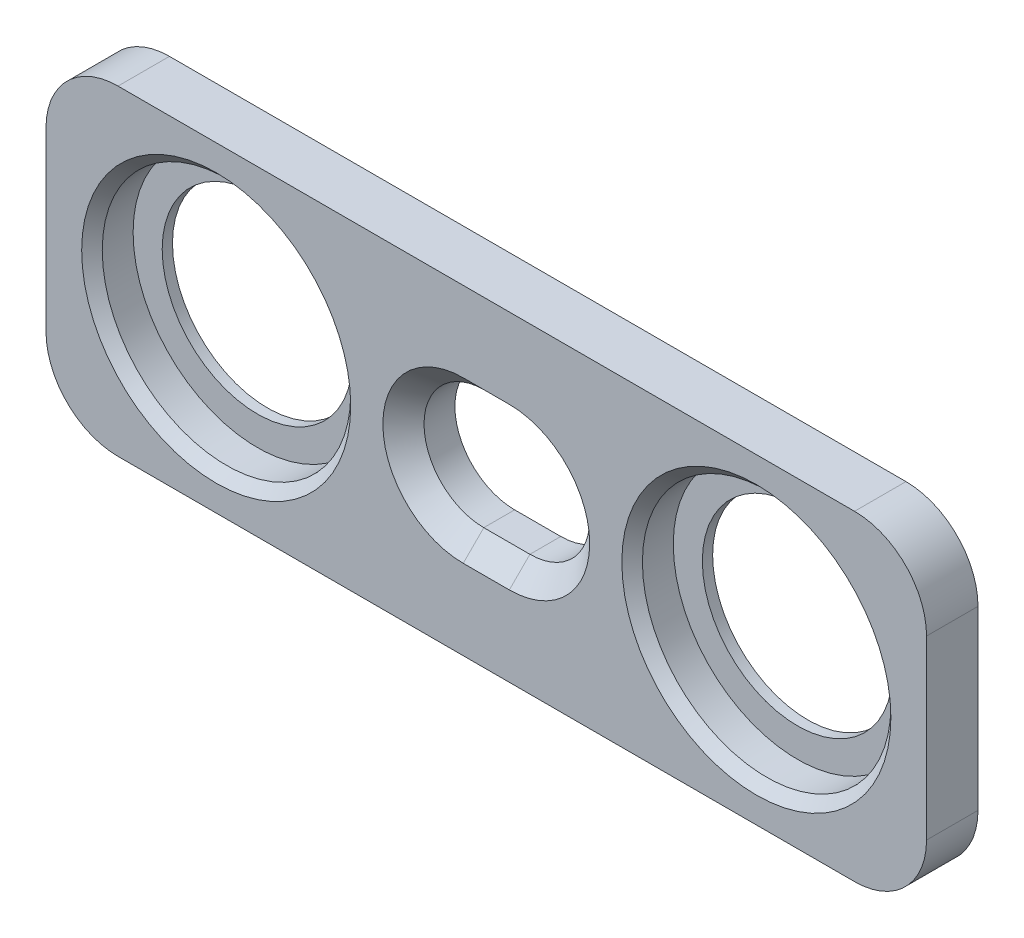
ISO-10303-21;
HEADER;
FILE_DESCRIPTION(('STEP AP214'),'2;1');
FILE_NAME('part.step','',(''),(''),'','','');
FILE_SCHEMA(('AUTOMOTIVE_DESIGN { 1 0 10303 214 1 1 1 1 }'));
ENDSEC;
DATA;
#1=APPLICATION_CONTEXT('core data for automotive mechanical design processes');
#2=APPLICATION_PROTOCOL_DEFINITION('international standard','automotive_design',2000,#1);
#3=PRODUCT_CONTEXT('',#1,'mechanical');
#4=PRODUCT('Part','Part','',(#3));
#5=PRODUCT_RELATED_PRODUCT_CATEGORY('part','',(#4));
#6=PRODUCT_DEFINITION_FORMATION('','',#4);
#7=PRODUCT_DEFINITION_CONTEXT('part definition',#1,'design');
#8=PRODUCT_DEFINITION('design','',#6,#7);
#9=PRODUCT_DEFINITION_SHAPE('','',#8);
#10=(LENGTH_UNIT() NAMED_UNIT(*) SI_UNIT(.MILLI.,.METRE.));
#11=(NAMED_UNIT(*) PLANE_ANGLE_UNIT() SI_UNIT($,.RADIAN.));
#12=(NAMED_UNIT(*) SI_UNIT($,.STERADIAN.) SOLID_ANGLE_UNIT());
#13=UNCERTAINTY_MEASURE_WITH_UNIT(LENGTH_MEASURE(1.E-05),#10,'distance_accuracy_value','');
#14=(GEOMETRIC_REPRESENTATION_CONTEXT(3) GLOBAL_UNCERTAINTY_ASSIGNED_CONTEXT((#13)) GLOBAL_UNIT_ASSIGNED_CONTEXT((#10,
#11,#12)) REPRESENTATION_CONTEXT('',''));
#15=CARTESIAN_POINT('',(0.,0.,0.));
#16=DIRECTION('',(0.,0.,1.));
#17=DIRECTION('',(1.,0.,0.));
#18=AXIS2_PLACEMENT_3D('',#15,#16,#17);
#19=CARTESIAN_POINT('',(-26.25,0.,5.));
#20=DIRECTION('',(0.,0.,-1.));
#21=DIRECTION('',(-1.,0.,0.));
#22=AXIS2_PLACEMENT_3D('',#19,#20,#21);
#23=CYLINDRICAL_SURFACE('',#22,12.075);
#24=CARTESIAN_POINT('',(-26.25,0.,3.99999999999998));
#25=DIRECTION('',(0.,0.,1.));
#26=DIRECTION('',(1.,0.,0.));
#27=AXIS2_PLACEMENT_3D('',#24,#25,#26);
#28=CIRCLE('',#27,12.075);
#29=CARTESIAN_POINT('',(-14.175,0.,3.99999999999998));
#30=VERTEX_POINT('',#29);
#31=EDGE_CURVE('E11',#30,#30,#28,.T.);
#32=ORIENTED_EDGE('',*,*,#31,.T.);
#33=EDGE_LOOP('',(#32));
#34=FACE_BOUND('',#33,.T.);
#35=CARTESIAN_POINT('',(-26.25,0.,1.));
#36=DIRECTION('',(0.,0.,-1.));
#37=DIRECTION('',(-1.,0.,0.));
#38=AXIS2_PLACEMENT_3D('',#35,#36,#37);
#39=CIRCLE('',#38,12.075);
#40=CARTESIAN_POINT('',(-38.325,0.,1.));
#41=VERTEX_POINT('',#40);
#42=EDGE_CURVE('E193',#41,#41,#39,.T.);
#43=ORIENTED_EDGE('',*,*,#42,.T.);
#44=EDGE_LOOP('',(#43));
#45=FACE_BOUND('',#44,.T.);
#46=ADVANCED_FACE('F39',(#34,#45),#23,.F.);
#47=CARTESIAN_POINT('',(26.25,0.,5.));
#48=DIRECTION('',(0.,0.,-1.));
#49=DIRECTION('',(-1.,0.,0.));
#50=AXIS2_PLACEMENT_3D('',#47,#48,#49);
#51=CYLINDRICAL_SURFACE('',#50,12.075);
#52=CARTESIAN_POINT('',(26.25,0.,3.99999999999998));
#53=DIRECTION('',(0.,0.,1.));
#54=DIRECTION('',(1.,0.,0.));
#55=AXIS2_PLACEMENT_3D('',#52,#53,#54);
#56=CIRCLE('',#55,12.075);
#57=CARTESIAN_POINT('',(38.325,0.,3.99999999999998));
#58=VERTEX_POINT('',#57);
#59=EDGE_CURVE('E272',#58,#58,#56,.T.);
#60=ORIENTED_EDGE('',*,*,#59,.T.);
#61=EDGE_LOOP('',(#60));
#62=FACE_BOUND('',#61,.T.);
#63=CARTESIAN_POINT('',(26.25,0.,1.));
#64=DIRECTION('',(0.,0.,-1.));
#65=DIRECTION('',(-1.,0.,0.));
#66=AXIS2_PLACEMENT_3D('',#63,#64,#65);
#67=CIRCLE('',#66,12.075);
#68=CARTESIAN_POINT('',(14.175,0.,1.));
#69=VERTEX_POINT('',#68);
#70=EDGE_CURVE('E190',#69,#69,#67,.T.);
#71=ORIENTED_EDGE('',*,*,#70,.T.);
#72=EDGE_LOOP('',(#71));
#73=FACE_BOUND('',#72,.T.);
#74=ADVANCED_FACE('F295',(#62,#73),#51,.F.);
#75=CARTESIAN_POINT('',(0.,0.,5.));
#76=DIRECTION('',(0.,0.,1.));
#77=DIRECTION('',(1.,0.,0.));
#78=AXIS2_PLACEMENT_3D('',#75,#76,#77);
#79=PLANE('',#78);
#80=CARTESIAN_POINT('',(26.25,0.,5.));
#81=DIRECTION('',(0.,0.,1.));
#82=DIRECTION('',(1.,0.,0.));
#83=AXIS2_PLACEMENT_3D('',#80,#81,#82);
#84=CIRCLE('',#83,13.075);
#85=CARTESIAN_POINT('',(39.325,0.,5.));
#86=VERTEX_POINT('',#85);
#87=EDGE_CURVE('E48',#86,#86,#84,.F.);
#88=ORIENTED_EDGE('',*,*,#87,.T.);
#89=EDGE_LOOP('',(#88));
#90=FACE_BOUND('',#89,.T.);
#91=CARTESIAN_POINT('',(-26.25,0.,5.));
#92=DIRECTION('',(0.,0.,1.));
#93=DIRECTION('',(1.,0.,0.));
#94=AXIS2_PLACEMENT_3D('',#91,#92,#93);
#95=CIRCLE('',#94,13.075);
#96=CARTESIAN_POINT('',(-13.175,0.,5.));
#97=VERTEX_POINT('',#96);
#98=EDGE_CURVE('E281',#97,#97,#95,.F.);
#99=ORIENTED_EDGE('',*,*,#98,.T.);
#100=EDGE_LOOP('',(#99));
#101=FACE_BOUND('',#100,.T.);
#102=CARTESIAN_POINT('',(2.24145707959568,0.,5.));
#103=DIRECTION('',(0.,0.,1.));
#104=DIRECTION('',(1.,0.,0.));
#105=AXIS2_PLACEMENT_3D('',#102,#103,#104);
#106=CIRCLE('',#105,7.80870622279399);
#107=CARTESIAN_POINT('',(2.24145707959568,7.80870622279399,5.));
#108=VERTEX_POINT('',#107);
#109=CARTESIAN_POINT('',(2.24145707959568,-7.80870622279399,5.));
#110=VERTEX_POINT('',#109);
#111=EDGE_CURVE('E264',#108,#110,#106,.F.);
#112=ORIENTED_EDGE('',*,*,#111,.T.);
#113=DIRECTION('',(-1.,0.,0.));
#114=VECTOR('',#113,1.);
#115=CARTESIAN_POINT('',(-2.24145707959568,-7.80870622279399,5.));
#116=LINE('',#115,#114);
#117=CARTESIAN_POINT('',(-2.24145707959568,-7.80870622279399,5.));
#118=VERTEX_POINT('',#117);
#119=EDGE_CURVE('E266',#110,#118,#116,.T.);
#120=ORIENTED_EDGE('',*,*,#119,.T.);
#121=CARTESIAN_POINT('',(-2.24145707959568,0.,5.));
#122=DIRECTION('',(0.,0.,1.));
#123=DIRECTION('',(1.,0.,0.));
#124=AXIS2_PLACEMENT_3D('',#121,#122,#123);
#125=CIRCLE('',#124,7.80870622279399);
#126=CARTESIAN_POINT('',(-2.24145707959568,7.80870622279399,5.));
#127=VERTEX_POINT('',#126);
#128=EDGE_CURVE('E262',#118,#127,#125,.F.);
#129=ORIENTED_EDGE('',*,*,#128,.T.);
#130=DIRECTION('',(1.,0.,0.));
#131=VECTOR('',#130,1.);
#132=CARTESIAN_POINT('',(2.24145707959568,7.80870622279399,5.));
#133=LINE('',#132,#131);
#134=EDGE_CURVE('E260',#127,#108,#133,.T.);
#135=ORIENTED_EDGE('',*,*,#134,.T.);
#136=EDGE_LOOP('',(#112,#120,#129,#135));
#137=FACE_BOUND('',#136,.T.);
#138=DIRECTION('',(0.,-1.,0.));
#139=VECTOR('',#138,1.);
#140=CARTESIAN_POINT('',(-42.791966577596,15.5862068431444,5.));
#141=LINE('',#140,#139);
#142=CARTESIAN_POINT('',(-42.791966577596,8.58620684314436,5.));
#143=VERTEX_POINT('',#142);
#144=CARTESIAN_POINT('',(-42.791966577596,-8.58620684314435,5.));
#145=VERTEX_POINT('',#144);
#146=EDGE_CURVE('E204',#143,#145,#141,.T.);
#147=ORIENTED_EDGE('',*,*,#146,.T.);
#148=CARTESIAN_POINT('',(-35.791966577596,-8.58620684314435,5.));
#149=DIRECTION('',(0.,0.,1.));
#150=DIRECTION('',(1.,0.,0.));
#151=AXIS2_PLACEMENT_3D('',#148,#149,#150);
#152=CIRCLE('',#151,7.);
#153=CARTESIAN_POINT('',(-35.791966577596,-15.5862068431443,5.));
#154=VERTEX_POINT('',#153);
#155=EDGE_CURVE('E246',#145,#154,#152,.T.);
#156=ORIENTED_EDGE('',*,*,#155,.T.);
#157=DIRECTION('',(1.,0.,0.));
#158=VECTOR('',#157,1.);
#159=CARTESIAN_POINT('',(-42.791966577596,-15.5862068431443,5.));
#160=LINE('',#159,#158);
#161=CARTESIAN_POINT('',(35.791966577596,-15.5862068431443,5.));
#162=VERTEX_POINT('',#161);
#163=EDGE_CURVE('E207',#154,#162,#160,.T.);
#164=ORIENTED_EDGE('',*,*,#163,.T.);
#165=CARTESIAN_POINT('',(35.791966577596,-8.58620684314435,5.));
#166=DIRECTION('',(0.,0.,1.));
#167=DIRECTION('',(1.,0.,0.));
#168=AXIS2_PLACEMENT_3D('',#165,#166,#167);
#169=CIRCLE('',#168,7.);
#170=CARTESIAN_POINT('',(42.791966577596,-8.58620684314435,5.));
#171=VERTEX_POINT('',#170);
#172=EDGE_CURVE('E244',#162,#171,#169,.T.);
#173=ORIENTED_EDGE('',*,*,#172,.T.);
#174=DIRECTION('',(0.,1.,0.));
#175=VECTOR('',#174,1.);
#176=CARTESIAN_POINT('',(42.791966577596,15.5862068431444,5.));
#177=LINE('',#176,#175);
#178=CARTESIAN_POINT('',(42.791966577596,8.58620684314436,5.));
#179=VERTEX_POINT('',#178);
#180=EDGE_CURVE('E197',#171,#179,#177,.T.);
#181=ORIENTED_EDGE('',*,*,#180,.T.);
#182=CARTESIAN_POINT('',(35.791966577596,8.58620684314436,5.));
#183=DIRECTION('',(0.,0.,1.));
#184=DIRECTION('',(1.,0.,0.));
#185=AXIS2_PLACEMENT_3D('',#182,#183,#184);
#186=CIRCLE('',#185,7.);
#187=CARTESIAN_POINT('',(35.791966577596,15.5862068431444,5.));
#188=VERTEX_POINT('',#187);
#189=EDGE_CURVE('E242',#179,#188,#186,.T.);
#190=ORIENTED_EDGE('',*,*,#189,.T.);
#191=DIRECTION('',(-1.,0.,0.));
#192=VECTOR('',#191,1.);
#193=CARTESIAN_POINT('',(-42.791966577596,15.5862068431444,5.));
#194=LINE('',#193,#192);
#195=CARTESIAN_POINT('',(-35.791966577596,15.5862068431444,5.));
#196=VERTEX_POINT('',#195);
#197=EDGE_CURVE('E200',#188,#196,#194,.T.);
#198=ORIENTED_EDGE('',*,*,#197,.T.);
#199=CARTESIAN_POINT('',(-35.791966577596,8.58620684314436,5.));
#200=DIRECTION('',(0.,0.,1.));
#201=DIRECTION('',(1.,0.,0.));
#202=AXIS2_PLACEMENT_3D('',#199,#200,#201);
#203=CIRCLE('',#202,7.);
#204=EDGE_CURVE('E240',#196,#143,#203,.T.);
#205=ORIENTED_EDGE('',*,*,#204,.T.);
#206=EDGE_LOOP('',(#147,#156,#164,#173,#181,#190,#198,#205));
#207=FACE_BOUND('',#206,.T.);
#208=ADVANCED_FACE('F286',(#90,#101,#137,#207),#79,.T.);
#209=CARTESIAN_POINT('',(0.,0.,0.));
#210=DIRECTION('',(0.,0.,1.));
#211=DIRECTION('',(1.,0.,0.));
#212=AXIS2_PLACEMENT_3D('',#209,#210,#211);
#213=PLANE('',#212);
#214=DIRECTION('',(-1.,0.,0.));
#215=VECTOR('',#214,1.);
#216=CARTESIAN_POINT('',(-2.24145707959568,5.80870622279398,0.));
#217=LINE('',#216,#215);
#218=CARTESIAN_POINT('',(2.24145707959568,5.80870622279398,0.));
#219=VERTEX_POINT('',#218);
#220=CARTESIAN_POINT('',(-2.24145707959568,5.80870622279398,0.));
#221=VERTEX_POINT('',#220);
#222=EDGE_CURVE('E154',#219,#221,#217,.T.);
#223=ORIENTED_EDGE('',*,*,#222,.T.);
#224=CARTESIAN_POINT('',(-2.24145707959568,0.,0.));
#225=DIRECTION('',(0.,0.,1.));
#226=DIRECTION('',(1.,0.,0.));
#227=AXIS2_PLACEMENT_3D('',#224,#225,#226);
#228=CIRCLE('',#227,5.80870622279398);
#229=CARTESIAN_POINT('',(-2.24145707959568,-5.80870622279398,0.));
#230=VERTEX_POINT('',#229);
#231=EDGE_CURVE('E146',#221,#230,#228,.T.);
#232=ORIENTED_EDGE('',*,*,#231,.T.);
#233=DIRECTION('',(1.,0.,0.));
#234=VECTOR('',#233,1.);
#235=CARTESIAN_POINT('',(-2.24145707959568,-5.80870622279398,0.));
#236=LINE('',#235,#234);
#237=CARTESIAN_POINT('',(2.24145707959568,-5.80870622279398,0.));
#238=VERTEX_POINT('',#237);
#239=EDGE_CURVE('E158',#230,#238,#236,.T.);
#240=ORIENTED_EDGE('',*,*,#239,.T.);
#241=CARTESIAN_POINT('',(2.24145707959568,0.,0.));
#242=DIRECTION('',(0.,0.,1.));
#243=DIRECTION('',(1.,0.,0.));
#244=AXIS2_PLACEMENT_3D('',#241,#242,#243);
#245=CIRCLE('',#244,5.80870622279398);
#246=EDGE_CURVE('E162',#238,#219,#245,.T.);
#247=ORIENTED_EDGE('',*,*,#246,.T.);
#248=EDGE_LOOP('',(#223,#232,#240,#247));
#249=FACE_BOUND('',#248,.T.);
#250=DIRECTION('',(1.,0.,0.));
#251=VECTOR('',#250,1.);
#252=CARTESIAN_POINT('',(-42.791966577596,-15.5862068431443,0.));
#253=LINE('',#252,#251);
#254=CARTESIAN_POINT('',(-35.791966577596,-15.5862068431443,0.));
#255=VERTEX_POINT('',#254);
#256=CARTESIAN_POINT('',(35.791966577596,-15.5862068431443,0.));
#257=VERTEX_POINT('',#256);
#258=EDGE_CURVE('E201',#255,#257,#253,.T.);
#259=ORIENTED_EDGE('',*,*,#258,.F.);
#260=CARTESIAN_POINT('',(-35.791966577596,-8.58620684314435,0.));
#261=DIRECTION('',(0.,0.,1.));
#262=DIRECTION('',(1.,0.,0.));
#263=AXIS2_PLACEMENT_3D('',#260,#261,#262);
#264=CIRCLE('',#263,7.);
#265=CARTESIAN_POINT('',(-42.791966577596,-8.58620684314435,0.));
#266=VERTEX_POINT('',#265);
#267=EDGE_CURVE('E233',#255,#266,#264,.F.);
#268=ORIENTED_EDGE('',*,*,#267,.T.);
#269=DIRECTION('',(0.,-1.,0.));
#270=VECTOR('',#269,1.);
#271=CARTESIAN_POINT('',(-42.791966577596,15.5862068431444,0.));
#272=LINE('',#271,#270);
#273=CARTESIAN_POINT('',(-42.791966577596,8.58620684314436,0.));
#274=VERTEX_POINT('',#273);
#275=EDGE_CURVE('E216',#274,#266,#272,.T.);
#276=ORIENTED_EDGE('',*,*,#275,.F.);
#277=CARTESIAN_POINT('',(-35.791966577596,8.58620684314436,0.));
#278=DIRECTION('',(0.,0.,1.));
#279=DIRECTION('',(1.,0.,0.));
#280=AXIS2_PLACEMENT_3D('',#277,#278,#279);
#281=CIRCLE('',#280,7.);
#282=CARTESIAN_POINT('',(-35.791966577596,15.5862068431444,0.));
#283=VERTEX_POINT('',#282);
#284=EDGE_CURVE('E227',#274,#283,#281,.F.);
#285=ORIENTED_EDGE('',*,*,#284,.T.);
#286=DIRECTION('',(-1.,0.,0.));
#287=VECTOR('',#286,1.);
#288=CARTESIAN_POINT('',(-42.791966577596,15.5862068431444,0.));
#289=LINE('',#288,#287);
#290=CARTESIAN_POINT('',(35.791966577596,15.5862068431444,0.));
#291=VERTEX_POINT('',#290);
#292=EDGE_CURVE('E213',#291,#283,#289,.T.);
#293=ORIENTED_EDGE('',*,*,#292,.F.);
#294=CARTESIAN_POINT('',(35.791966577596,8.58620684314436,0.));
#295=DIRECTION('',(0.,0.,1.));
#296=DIRECTION('',(1.,0.,0.));
#297=AXIS2_PLACEMENT_3D('',#294,#295,#296);
#298=CIRCLE('',#297,7.);
#299=CARTESIAN_POINT('',(42.791966577596,8.58620684314436,0.));
#300=VERTEX_POINT('',#299);
#301=EDGE_CURVE('E229',#291,#300,#298,.F.);
#302=ORIENTED_EDGE('',*,*,#301,.T.);
#303=DIRECTION('',(0.,1.,0.));
#304=VECTOR('',#303,1.);
#305=CARTESIAN_POINT('',(42.791966577596,15.5862068431444,0.));
#306=LINE('',#305,#304);
#307=CARTESIAN_POINT('',(42.791966577596,-8.58620684314435,0.));
#308=VERTEX_POINT('',#307);
#309=EDGE_CURVE('E196',#308,#300,#306,.T.);
#310=ORIENTED_EDGE('',*,*,#309,.F.);
#311=CARTESIAN_POINT('',(35.791966577596,-8.58620684314435,0.));
#312=DIRECTION('',(0.,0.,1.));
#313=DIRECTION('',(1.,0.,0.));
#314=AXIS2_PLACEMENT_3D('',#311,#312,#313);
#315=CIRCLE('',#314,7.);
#316=EDGE_CURVE('E231',#308,#257,#315,.F.);
#317=ORIENTED_EDGE('',*,*,#316,.T.);
#318=EDGE_LOOP('',(#259,#268,#276,#285,#293,#302,#310,#317));
#319=FACE_BOUND('',#318,.T.);
#320=CARTESIAN_POINT('',(26.25,0.,0.));
#321=DIRECTION('',(0.,0.,-1.));
#322=DIRECTION('',(-1.,0.,0.));
#323=AXIS2_PLACEMENT_3D('',#320,#321,#322);
#324=CIRCLE('',#323,9.25);
#325=CARTESIAN_POINT('',(17.,0.,0.));
#326=VERTEX_POINT('',#325);
#327=EDGE_CURVE('E184',#326,#326,#324,.T.);
#328=ORIENTED_EDGE('',*,*,#327,.F.);
#329=EDGE_LOOP('',(#328));
#330=FACE_BOUND('',#329,.T.);
#331=CARTESIAN_POINT('',(-26.25,0.,0.));
#332=DIRECTION('',(0.,0.,-1.));
#333=DIRECTION('',(-1.,0.,0.));
#334=AXIS2_PLACEMENT_3D('',#331,#332,#333);
#335=CIRCLE('',#334,9.25);
#336=CARTESIAN_POINT('',(-35.5,0.,0.));
#337=VERTEX_POINT('',#336);
#338=EDGE_CURVE('E177',#337,#337,#335,.T.);
#339=ORIENTED_EDGE('',*,*,#338,.F.);
#340=EDGE_LOOP('',(#339));
#341=FACE_BOUND('',#340,.T.);
#342=ADVANCED_FACE('F164',(#249,#319,#330,#341),#213,.F.);
#343=CARTESIAN_POINT('',(42.791966577596,15.5862068431444,5.));
#344=DIRECTION('',(-1.,0.,0.));
#345=DIRECTION('',(0.,-1.,0.));
#346=AXIS2_PLACEMENT_3D('',#343,#344,#345);
#347=PLANE('',#346);
#348=ORIENTED_EDGE('',*,*,#180,.F.);
#349=DIRECTION('',(0.,0.,-1.));
#350=VECTOR('',#349,1.);
#351=CARTESIAN_POINT('',(42.791966577596,-8.58620684314435,5.));
#352=LINE('',#351,#350);
#353=EDGE_CURVE('E250',#171,#308,#352,.T.);
#354=ORIENTED_EDGE('',*,*,#353,.T.);
#355=ORIENTED_EDGE('',*,*,#309,.T.);
#356=DIRECTION('',(0.,0.,-1.));
#357=VECTOR('',#356,1.);
#358=CARTESIAN_POINT('',(42.791966577596,8.58620684314436,5.));
#359=LINE('',#358,#357);
#360=EDGE_CURVE('E248',#300,#179,#359,.F.);
#361=ORIENTED_EDGE('',*,*,#360,.T.);
#362=EDGE_LOOP('',(#348,#354,#355,#361));
#363=FACE_BOUND('',#362,.T.);
#364=ADVANCED_FACE('F330',(#363),#347,.F.);
#365=CARTESIAN_POINT('',(-42.791966577596,15.5862068431444,5.));
#366=DIRECTION('',(0.,-1.,0.));
#367=DIRECTION('',(0.,0.,-1.));
#368=AXIS2_PLACEMENT_3D('',#365,#366,#367);
#369=PLANE('',#368);
#370=ORIENTED_EDGE('',*,*,#197,.F.);
#371=DIRECTION('',(0.,0.,-1.));
#372=VECTOR('',#371,1.);
#373=CARTESIAN_POINT('',(35.791966577596,15.5862068431444,5.));
#374=LINE('',#373,#372);
#375=EDGE_CURVE('E255',#188,#291,#374,.T.);
#376=ORIENTED_EDGE('',*,*,#375,.T.);
#377=ORIENTED_EDGE('',*,*,#292,.T.);
#378=DIRECTION('',(0.,0.,-1.));
#379=VECTOR('',#378,1.);
#380=CARTESIAN_POINT('',(-35.791966577596,15.5862068431444,5.));
#381=LINE('',#380,#379);
#382=EDGE_CURVE('E253',#283,#196,#381,.F.);
#383=ORIENTED_EDGE('',*,*,#382,.T.);
#384=EDGE_LOOP('',(#370,#376,#377,#383));
#385=FACE_BOUND('',#384,.T.);
#386=ADVANCED_FACE('F334',(#385),#369,.F.);
#387=CARTESIAN_POINT('',(-42.791966577596,15.5862068431444,5.));
#388=DIRECTION('',(1.,0.,0.));
#389=DIRECTION('',(0.,0.,-1.));
#390=AXIS2_PLACEMENT_3D('',#387,#388,#389);
#391=PLANE('',#390);
#392=ORIENTED_EDGE('',*,*,#275,.T.);
#393=DIRECTION('',(0.,0.,-1.));
#394=VECTOR('',#393,1.);
#395=CARTESIAN_POINT('',(-42.791966577596,-8.58620684314435,5.));
#396=LINE('',#395,#394);
#397=EDGE_CURVE('E238',#266,#145,#396,.F.);
#398=ORIENTED_EDGE('',*,*,#397,.T.);
#399=ORIENTED_EDGE('',*,*,#146,.F.);
#400=DIRECTION('',(0.,0.,-1.));
#401=VECTOR('',#400,1.);
#402=CARTESIAN_POINT('',(-42.791966577596,8.58620684314436,5.));
#403=LINE('',#402,#401);
#404=EDGE_CURVE('E235',#143,#274,#403,.T.);
#405=ORIENTED_EDGE('',*,*,#404,.T.);
#406=EDGE_LOOP('',(#392,#398,#399,#405));
#407=FACE_BOUND('',#406,.T.);
#408=ADVANCED_FACE('F314',(#407),#391,.F.);
#409=CARTESIAN_POINT('',(-42.791966577596,-15.5862068431443,5.));
#410=DIRECTION('',(0.,1.,0.));
#411=DIRECTION('',(0.,0.,1.));
#412=AXIS2_PLACEMENT_3D('',#409,#410,#411);
#413=PLANE('',#412);
#414=ORIENTED_EDGE('',*,*,#163,.F.);
#415=DIRECTION('',(0.,0.,-1.));
#416=VECTOR('',#415,1.);
#417=CARTESIAN_POINT('',(-35.791966577596,-15.5862068431443,5.));
#418=LINE('',#417,#416);
#419=EDGE_CURVE('E224',#154,#255,#418,.T.);
#420=ORIENTED_EDGE('',*,*,#419,.T.);
#421=ORIENTED_EDGE('',*,*,#258,.T.);
#422=DIRECTION('',(0.,0.,-1.));
#423=VECTOR('',#422,1.);
#424=CARTESIAN_POINT('',(35.791966577596,-15.5862068431443,5.));
#425=LINE('',#424,#423);
#426=EDGE_CURVE('E210',#257,#162,#425,.F.);
#427=ORIENTED_EDGE('',*,*,#426,.T.);
#428=EDGE_LOOP('',(#414,#420,#421,#427));
#429=FACE_BOUND('',#428,.T.);
#430=ADVANCED_FACE('F304',(#429),#413,.F.);
#431=CARTESIAN_POINT('',(0.,0.,1.));
#432=DIRECTION('',(0.,0.,-1.));
#433=DIRECTION('',(-1.,0.,0.));
#434=AXIS2_PLACEMENT_3D('',#431,#432,#433);
#435=PLANE('',#434);
#436=CARTESIAN_POINT('',(26.25,0.,1.));
#437=DIRECTION('',(0.,0.,-1.));
#438=DIRECTION('',(-1.,0.,0.));
#439=AXIS2_PLACEMENT_3D('',#436,#437,#438);
#440=CIRCLE('',#439,9.25);
#441=CARTESIAN_POINT('',(17.,0.,1.));
#442=VERTEX_POINT('',#441);
#443=EDGE_CURVE('E187',#442,#442,#440,.T.);
#444=ORIENTED_EDGE('',*,*,#443,.T.);
#445=EDGE_LOOP('',(#444));
#446=FACE_BOUND('',#445,.T.);
#447=ORIENTED_EDGE('',*,*,#70,.F.);
#448=EDGE_LOOP('',(#447));
#449=FACE_BOUND('',#448,.T.);
#450=ADVANCED_FACE('F301',(#446,#449),#435,.F.);
#451=CARTESIAN_POINT('',(26.25,0.,1.));
#452=DIRECTION('',(0.,0.,-1.));
#453=DIRECTION('',(-1.,0.,0.));
#454=AXIS2_PLACEMENT_3D('',#451,#452,#453);
#455=CYLINDRICAL_SURFACE('',#454,9.25);
#456=ORIENTED_EDGE('',*,*,#443,.F.);
#457=EDGE_LOOP('',(#456));
#458=FACE_BOUND('',#457,.T.);
#459=ORIENTED_EDGE('',*,*,#327,.T.);
#460=EDGE_LOOP('',(#459));
#461=FACE_BOUND('',#460,.T.);
#462=ADVANCED_FACE('F303',(#458,#461),#455,.F.);
#463=CARTESIAN_POINT('',(-26.25,0.,1.));
#464=DIRECTION('',(0.,0.,-1.));
#465=DIRECTION('',(-1.,0.,0.));
#466=AXIS2_PLACEMENT_3D('',#463,#464,#465);
#467=CIRCLE('',#466,9.25);
#468=CARTESIAN_POINT('',(-35.5,0.,1.));
#469=VERTEX_POINT('',#468);
#470=EDGE_CURVE('E181',#469,#469,#467,.T.);
#471=ORIENTED_EDGE('',*,*,#470,.T.);
#472=EDGE_LOOP('',(#471));
#473=FACE_BOUND('',#472,.T.);
#474=ORIENTED_EDGE('',*,*,#42,.F.);
#475=EDGE_LOOP('',(#474));
#476=FACE_BOUND('',#475,.T.);
#477=ADVANCED_FACE('F307',(#473,#476),#435,.F.);
#478=CARTESIAN_POINT('',(-26.25,0.,1.));
#479=DIRECTION('',(0.,0.,-1.));
#480=DIRECTION('',(-1.,0.,0.));
#481=AXIS2_PLACEMENT_3D('',#478,#479,#480);
#482=CYLINDRICAL_SURFACE('',#481,9.25);
#483=ORIENTED_EDGE('',*,*,#470,.F.);
#484=EDGE_LOOP('',(#483));
#485=FACE_BOUND('',#484,.T.);
#486=ORIENTED_EDGE('',*,*,#338,.T.);
#487=EDGE_LOOP('',(#486));
#488=FACE_BOUND('',#487,.T.);
#489=ADVANCED_FACE('F318',(#485,#488),#482,.F.);
#490=CARTESIAN_POINT('',(-35.791966577596,-8.58620684314435,5.));
#491=DIRECTION('',(0.,0.,-1.));
#492=DIRECTION('',(-1.,0.,0.));
#493=AXIS2_PLACEMENT_3D('',#490,#491,#492);
#494=CYLINDRICAL_SURFACE('',#493,7.);
#495=ORIENTED_EDGE('',*,*,#155,.F.);
#496=ORIENTED_EDGE('',*,*,#397,.F.);
#497=ORIENTED_EDGE('',*,*,#267,.F.);
#498=ORIENTED_EDGE('',*,*,#419,.F.);
#499=EDGE_LOOP('',(#495,#496,#497,#498));
#500=FACE_BOUND('',#499,.T.);
#501=ADVANCED_FACE('F342',(#500),#494,.T.);
#502=CARTESIAN_POINT('',(35.791966577596,-8.58620684314435,5.));
#503=DIRECTION('',(0.,0.,-1.));
#504=DIRECTION('',(-1.,0.,0.));
#505=AXIS2_PLACEMENT_3D('',#502,#503,#504);
#506=CYLINDRICAL_SURFACE('',#505,7.);
#507=ORIENTED_EDGE('',*,*,#172,.F.);
#508=ORIENTED_EDGE('',*,*,#426,.F.);
#509=ORIENTED_EDGE('',*,*,#316,.F.);
#510=ORIENTED_EDGE('',*,*,#353,.F.);
#511=EDGE_LOOP('',(#507,#508,#509,#510));
#512=FACE_BOUND('',#511,.T.);
#513=ADVANCED_FACE('F345',(#512),#506,.T.);
#514=CARTESIAN_POINT('',(35.791966577596,8.58620684314436,5.));
#515=DIRECTION('',(0.,0.,-1.));
#516=DIRECTION('',(-1.,0.,0.));
#517=AXIS2_PLACEMENT_3D('',#514,#515,#516);
#518=CYLINDRICAL_SURFACE('',#517,7.);
#519=ORIENTED_EDGE('',*,*,#189,.F.);
#520=ORIENTED_EDGE('',*,*,#360,.F.);
#521=ORIENTED_EDGE('',*,*,#301,.F.);
#522=ORIENTED_EDGE('',*,*,#375,.F.);
#523=EDGE_LOOP('',(#519,#520,#521,#522));
#524=FACE_BOUND('',#523,.T.);
#525=ADVANCED_FACE('F349',(#524),#518,.T.);
#526=CARTESIAN_POINT('',(-35.791966577596,8.58620684314436,5.));
#527=DIRECTION('',(0.,0.,-1.));
#528=DIRECTION('',(-1.,0.,0.));
#529=AXIS2_PLACEMENT_3D('',#526,#527,#528);
#530=CYLINDRICAL_SURFACE('',#529,7.);
#531=ORIENTED_EDGE('',*,*,#204,.F.);
#532=ORIENTED_EDGE('',*,*,#382,.F.);
#533=ORIENTED_EDGE('',*,*,#284,.F.);
#534=ORIENTED_EDGE('',*,*,#404,.F.);
#535=EDGE_LOOP('',(#531,#532,#533,#534));
#536=FACE_BOUND('',#535,.T.);
#537=ADVANCED_FACE('F353',(#536),#530,.T.);
#538=CARTESIAN_POINT('',(-2.24145707959568,0.,0.));
#539=DIRECTION('',(0.,0.,1.));
#540=DIRECTION('',(1.,0.,0.));
#541=AXIS2_PLACEMENT_3D('',#538,#539,#540);
#542=CYLINDRICAL_SURFACE('',#541,5.80870622279398);
#543=DIRECTION('',(0.,0.,1.));
#544=VECTOR('',#543,1.);
#545=CARTESIAN_POINT('',(-2.24145707959568,5.80870622279398,0.));
#546=LINE('',#545,#544);
#547=CARTESIAN_POINT('',(-2.24145707959568,5.80870622279398,3.));
#548=VERTEX_POINT('',#547);
#549=EDGE_CURVE('E175',#221,#548,#546,.T.);
#550=ORIENTED_EDGE('',*,*,#549,.T.);
#551=CARTESIAN_POINT('',(-2.24145707959568,0.,3.));
#552=DIRECTION('',(0.,0.,1.));
#553=DIRECTION('',(1.,0.,0.));
#554=AXIS2_PLACEMENT_3D('',#551,#552,#553);
#555=CIRCLE('',#554,5.80870622279398);
#556=CARTESIAN_POINT('',(-2.24145707959568,-5.80870622279398,3.));
#557=VERTEX_POINT('',#556);
#558=EDGE_CURVE('E149',#548,#557,#555,.T.);
#559=ORIENTED_EDGE('',*,*,#558,.T.);
#560=DIRECTION('',(0.,0.,1.));
#561=VECTOR('',#560,1.);
#562=CARTESIAN_POINT('',(-2.24145707959568,-5.80870622279398,0.));
#563=LINE('',#562,#561);
#564=EDGE_CURVE('E142',#230,#557,#563,.T.);
#565=ORIENTED_EDGE('',*,*,#564,.F.);
#566=ORIENTED_EDGE('',*,*,#231,.F.);
#567=EDGE_LOOP('',(#550,#559,#565,#566));
#568=FACE_BOUND('',#567,.T.);
#569=ADVANCED_FACE('F144',(#568),#542,.F.);
#570=CARTESIAN_POINT('',(-2.24145707959568,5.80870622279398,0.));
#571=DIRECTION('',(0.,1.,0.));
#572=DIRECTION('',(0.,0.,1.));
#573=AXIS2_PLACEMENT_3D('',#570,#571,#572);
#574=PLANE('',#573);
#575=DIRECTION('',(0.,0.,1.));
#576=VECTOR('',#575,1.);
#577=CARTESIAN_POINT('',(2.24145707959568,5.80870622279398,0.));
#578=LINE('',#577,#576);
#579=CARTESIAN_POINT('',(2.24145707959568,5.80870622279398,3.));
#580=VERTEX_POINT('',#579);
#581=EDGE_CURVE('E178',#219,#580,#578,.T.);
#582=ORIENTED_EDGE('',*,*,#581,.T.);
#583=DIRECTION('',(-1.,0.,0.));
#584=VECTOR('',#583,1.);
#585=CARTESIAN_POINT('',(-2.24145707959568,5.80870622279398,3.));
#586=LINE('',#585,#584);
#587=EDGE_CURVE('E55',#580,#548,#586,.T.);
#588=ORIENTED_EDGE('',*,*,#587,.T.);
#589=ORIENTED_EDGE('',*,*,#549,.F.);
#590=ORIENTED_EDGE('',*,*,#222,.F.);
#591=EDGE_LOOP('',(#582,#588,#589,#590));
#592=FACE_BOUND('',#591,.T.);
#593=ADVANCED_FACE('F404',(#592),#574,.F.);
#594=CARTESIAN_POINT('',(2.24145707959568,0.,0.));
#595=DIRECTION('',(0.,0.,1.));
#596=DIRECTION('',(1.,0.,0.));
#597=AXIS2_PLACEMENT_3D('',#594,#595,#596);
#598=CYLINDRICAL_SURFACE('',#597,5.80870622279398);
#599=DIRECTION('',(0.,0.,1.));
#600=VECTOR('',#599,1.);
#601=CARTESIAN_POINT('',(2.24145707959568,-5.80870622279398,0.));
#602=LINE('',#601,#600);
#603=CARTESIAN_POINT('',(2.24145707959568,-5.80870622279398,3.));
#604=VERTEX_POINT('',#603);
#605=EDGE_CURVE('E153',#238,#604,#602,.T.);
#606=ORIENTED_EDGE('',*,*,#605,.T.);
#607=CARTESIAN_POINT('',(2.24145707959568,0.,3.));
#608=DIRECTION('',(0.,0.,1.));
#609=DIRECTION('',(1.,0.,0.));
#610=AXIS2_PLACEMENT_3D('',#607,#608,#609);
#611=CIRCLE('',#610,5.80870622279398);
#612=EDGE_CURVE('E63',#604,#580,#611,.T.);
#613=ORIENTED_EDGE('',*,*,#612,.T.);
#614=ORIENTED_EDGE('',*,*,#581,.F.);
#615=ORIENTED_EDGE('',*,*,#246,.F.);
#616=EDGE_LOOP('',(#606,#613,#614,#615));
#617=FACE_BOUND('',#616,.T.);
#618=ADVANCED_FACE('F392',(#617),#598,.F.);
#619=CARTESIAN_POINT('',(-2.24145707959568,-5.80870622279398,0.));
#620=DIRECTION('',(0.,-1.,0.));
#621=DIRECTION('',(0.,0.,-1.));
#622=AXIS2_PLACEMENT_3D('',#619,#620,#621);
#623=PLANE('',#622);
#624=ORIENTED_EDGE('',*,*,#564,.T.);
#625=DIRECTION('',(1.,0.,0.));
#626=VECTOR('',#625,1.);
#627=CARTESIAN_POINT('',(2.24145707959568,-5.80870622279398,3.));
#628=LINE('',#627,#626);
#629=EDGE_CURVE('E258',#557,#604,#628,.T.);
#630=ORIENTED_EDGE('',*,*,#629,.T.);
#631=ORIENTED_EDGE('',*,*,#605,.F.);
#632=ORIENTED_EDGE('',*,*,#239,.F.);
#633=EDGE_LOOP('',(#624,#630,#631,#632));
#634=FACE_BOUND('',#633,.T.);
#635=ADVANCED_FACE('F159',(#634),#623,.F.);
#636=CARTESIAN_POINT('',(-2.24145707959568,5.80870622279398,3.));
#637=DIRECTION('',(0.,-0.707106781186545,0.70710678118655));
#638=DIRECTION('',(1.,0.,0.));
#639=AXIS2_PLACEMENT_3D('',#636,#637,#638);
#640=PLANE('',#639);
#641=DIRECTION('',(0.,-0.70710678118655,-0.707106781186545));
#642=VECTOR('',#641,1.);
#643=CARTESIAN_POINT('',(2.24145707959568,7.80870622279399,5.));
#644=LINE('',#643,#642);
#645=EDGE_CURVE('E170',#108,#580,#644,.T.);
#646=ORIENTED_EDGE('',*,*,#645,.F.);
#647=ORIENTED_EDGE('',*,*,#134,.F.);
#648=DIRECTION('',(0.,0.70710678118655,0.707106781186545));
#649=VECTOR('',#648,1.);
#650=CARTESIAN_POINT('',(-2.24145707959568,5.80870622279398,3.));
#651=LINE('',#650,#649);
#652=EDGE_CURVE('E167',#548,#127,#651,.T.);
#653=ORIENTED_EDGE('',*,*,#652,.F.);
#654=ORIENTED_EDGE('',*,*,#587,.F.);
#655=EDGE_LOOP('',(#646,#647,#653,#654));
#656=FACE_BOUND('',#655,.T.);
#657=ADVANCED_FACE('F379',(#656),#640,.T.);
#658=CARTESIAN_POINT('',(-2.24145707959568,0.,3.));
#659=DIRECTION('',(0.,0.,1.));
#660=DIRECTION('',(1.,0.,0.));
#661=AXIS2_PLACEMENT_3D('',#658,#659,#660);
#662=CONICAL_SURFACE('',#661,5.80870622279398,0.785398163397452);
#663=ORIENTED_EDGE('',*,*,#652,.T.);
#664=ORIENTED_EDGE('',*,*,#128,.F.);
#665=DIRECTION('',(0.,-0.70710678118655,0.707106781186545));
#666=VECTOR('',#665,1.);
#667=CARTESIAN_POINT('',(-2.24145707959568,-5.80870622279398,3.));
#668=LINE('',#667,#666);
#669=EDGE_CURVE('E275',#557,#118,#668,.T.);
#670=ORIENTED_EDGE('',*,*,#669,.F.);
#671=ORIENTED_EDGE('',*,*,#558,.F.);
#672=EDGE_LOOP('',(#663,#664,#670,#671));
#673=FACE_BOUND('',#672,.T.);
#674=ADVANCED_FACE('F372',(#673),#662,.F.);
#675=CARTESIAN_POINT('',(2.24145707959568,0.,3.));
#676=DIRECTION('',(0.,0.,1.));
#677=DIRECTION('',(1.,0.,0.));
#678=AXIS2_PLACEMENT_3D('',#675,#676,#677);
#679=CONICAL_SURFACE('',#678,5.80870622279398,0.785398163397452);
#680=ORIENTED_EDGE('',*,*,#645,.T.);
#681=ORIENTED_EDGE('',*,*,#612,.F.);
#682=DIRECTION('',(0.,0.70710678118655,-0.707106781186545));
#683=VECTOR('',#682,1.);
#684=CARTESIAN_POINT('',(2.24145707959568,-7.80870622279399,5.));
#685=LINE('',#684,#683);
#686=EDGE_CURVE('E273',#110,#604,#685,.T.);
#687=ORIENTED_EDGE('',*,*,#686,.F.);
#688=ORIENTED_EDGE('',*,*,#111,.F.);
#689=EDGE_LOOP('',(#680,#681,#687,#688));
#690=FACE_BOUND('',#689,.T.);
#691=ADVANCED_FACE('F365',(#690),#679,.F.);
#692=CARTESIAN_POINT('',(-2.24145707959568,-5.80870622279398,3.));
#693=DIRECTION('',(0.,0.707106781186545,0.70710678118655));
#694=DIRECTION('',(-1.,0.,0.));
#695=AXIS2_PLACEMENT_3D('',#692,#693,#694);
#696=PLANE('',#695);
#697=ORIENTED_EDGE('',*,*,#669,.T.);
#698=ORIENTED_EDGE('',*,*,#119,.F.);
#699=ORIENTED_EDGE('',*,*,#686,.T.);
#700=ORIENTED_EDGE('',*,*,#629,.F.);
#701=EDGE_LOOP('',(#697,#698,#699,#700));
#702=FACE_BOUND('',#701,.T.);
#703=ADVANCED_FACE('F292',(#702),#696,.T.);
#704=CARTESIAN_POINT('',(26.25,0.,3.99999999999998));
#705=DIRECTION('',(0.,0.,1.));
#706=DIRECTION('',(1.,0.,0.));
#707=AXIS2_PLACEMENT_3D('',#704,#705,#706);
#708=CONICAL_SURFACE('',#707,12.075,0.785398163397448);
#709=ORIENTED_EDGE('',*,*,#87,.F.);
#710=EDGE_LOOP('',(#709));
#711=FACE_BOUND('',#710,.T.);
#712=ORIENTED_EDGE('',*,*,#59,.F.);
#713=EDGE_LOOP('',(#712));
#714=FACE_BOUND('',#713,.T.);
#715=ADVANCED_FACE('F289',(#711,#714),#708,.F.);
#716=CARTESIAN_POINT('',(-26.25,0.,3.99999999999998));
#717=DIRECTION('',(0.,0.,1.));
#718=DIRECTION('',(1.,0.,0.));
#719=AXIS2_PLACEMENT_3D('',#716,#717,#718);
#720=CONICAL_SURFACE('',#719,12.075,0.785398163397447);
#721=ORIENTED_EDGE('',*,*,#98,.F.);
#722=EDGE_LOOP('',(#721));
#723=FACE_BOUND('',#722,.T.);
#724=ORIENTED_EDGE('',*,*,#31,.F.);
#725=EDGE_LOOP('',(#724));
#726=FACE_BOUND('',#725,.T.);
#727=ADVANCED_FACE('F42',(#723,#726),#720,.F.);
#728=CLOSED_SHELL('',(#46,#74,#208,#342,#364,#386,#408,#430,#450,#462,#477,#489,#501,#513,#525,
#537,#569,#593,#618,#635,#657,#674,#691,#703,#715,#727));
#729=MANIFOLD_SOLID_BREP('B2',#728);
#730=ADVANCED_BREP_SHAPE_REPRESENTATION('',(#18,#729),#14);
#731=SHAPE_DEFINITION_REPRESENTATION(#9,#730);
ENDSEC;
END-ISO-10303-21;
